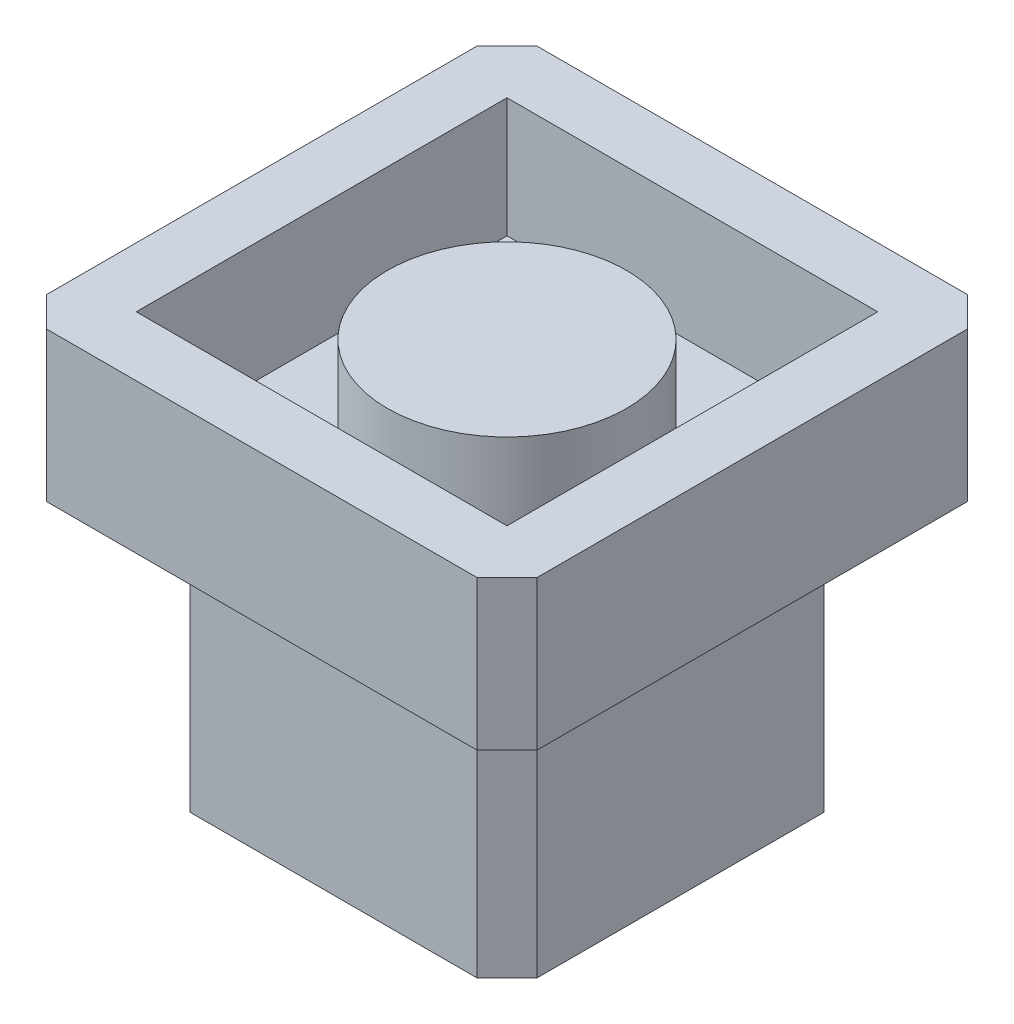
ISO-10303-21;
HEADER;
FILE_DESCRIPTION(('STEP AP214'),'2;1');
FILE_NAME('part.step','',(''),(''),'','','');
FILE_SCHEMA(('AUTOMOTIVE_DESIGN { 1 0 10303 214 1 1 1 1 }'));
ENDSEC;
DATA;
#1=APPLICATION_CONTEXT('core data for automotive mechanical design processes');
#2=APPLICATION_PROTOCOL_DEFINITION('international standard','automotive_design',2000,#1);
#3=PRODUCT_CONTEXT('',#1,'mechanical');
#4=PRODUCT('Part','Part','',(#3));
#5=PRODUCT_RELATED_PRODUCT_CATEGORY('part','',(#4));
#6=PRODUCT_DEFINITION_FORMATION('','',#4);
#7=PRODUCT_DEFINITION_CONTEXT('part definition',#1,'design');
#8=PRODUCT_DEFINITION('design','',#6,#7);
#9=PRODUCT_DEFINITION_SHAPE('','',#8);
#10=(LENGTH_UNIT() NAMED_UNIT(*) SI_UNIT(.MILLI.,.METRE.));
#11=(NAMED_UNIT(*) PLANE_ANGLE_UNIT() SI_UNIT($,.RADIAN.));
#12=(NAMED_UNIT(*) SI_UNIT($,.STERADIAN.) SOLID_ANGLE_UNIT());
#13=UNCERTAINTY_MEASURE_WITH_UNIT(LENGTH_MEASURE(1.E-05),#10,'distance_accuracy_value','');
#14=(GEOMETRIC_REPRESENTATION_CONTEXT(3) GLOBAL_UNCERTAINTY_ASSIGNED_CONTEXT((#13)) GLOBAL_UNIT_ASSIGNED_CONTEXT((#10,
#11,#12)) REPRESENTATION_CONTEXT('',''));
#15=CARTESIAN_POINT('',(0.,0.,0.));
#16=DIRECTION('',(0.,0.,1.));
#17=DIRECTION('',(1.,0.,0.));
#18=AXIS2_PLACEMENT_3D('',#15,#16,#17);
#19=CARTESIAN_POINT('',(0.,-5.,0.));
#20=DIRECTION('',(0.,-1.,0.));
#21=DIRECTION('',(0.,0.,-1.));
#22=AXIS2_PLACEMENT_3D('',#19,#20,#21);
#23=PLANE('',#22);
#24=DIRECTION('',(-1.,0.,0.));
#25=VECTOR('',#24,1.);
#26=CARTESIAN_POINT('',(-2.9,-5.,2.9));
#27=LINE('',#26,#25);
#28=CARTESIAN_POINT('',(2.4,-5.,2.9));
#29=VERTEX_POINT('',#28);
#30=CARTESIAN_POINT('',(-2.4,-5.,2.9));
#31=VERTEX_POINT('',#30);
#32=EDGE_CURVE('E378',#29,#31,#27,.T.);
#33=ORIENTED_EDGE('',*,*,#32,.T.);
#34=DIRECTION('',(0.707106781186549,0.,0.707106781186546));
#35=VECTOR('',#34,1.);
#36=CARTESIAN_POINT('',(-2.65,-5.,2.65));
#37=LINE('',#36,#35);
#38=CARTESIAN_POINT('',(-2.9,-5.,2.4));
#39=VERTEX_POINT('',#38);
#40=EDGE_CURVE('E565',#31,#39,#37,.F.);
#41=ORIENTED_EDGE('',*,*,#40,.T.);
#42=DIRECTION('',(0.,0.,-1.));
#43=VECTOR('',#42,1.);
#44=CARTESIAN_POINT('',(-2.9,-5.,2.9));
#45=LINE('',#44,#43);
#46=CARTESIAN_POINT('',(-2.9,-5.,-2.4));
#47=VERTEX_POINT('',#46);
#48=EDGE_CURVE('E383',#39,#47,#45,.T.);
#49=ORIENTED_EDGE('',*,*,#48,.T.);
#50=DIRECTION('',(-0.707106781186546,0.,0.707106781186549));
#51=VECTOR('',#50,1.);
#52=CARTESIAN_POINT('',(-2.65,-5.,-2.65));
#53=LINE('',#52,#51);
#54=CARTESIAN_POINT('',(-2.4,-5.,-2.9));
#55=VERTEX_POINT('',#54);
#56=EDGE_CURVE('E559',#47,#55,#53,.F.);
#57=ORIENTED_EDGE('',*,*,#56,.T.);
#58=DIRECTION('',(1.,0.,0.));
#59=VECTOR('',#58,1.);
#60=CARTESIAN_POINT('',(-2.9,-5.,-2.9));
#61=LINE('',#60,#59);
#62=CARTESIAN_POINT('',(2.4,-5.,-2.9));
#63=VERTEX_POINT('',#62);
#64=EDGE_CURVE('E387',#55,#63,#61,.T.);
#65=ORIENTED_EDGE('',*,*,#64,.T.);
#66=DIRECTION('',(-0.707106781186549,0.,-0.707106781186546));
#67=VECTOR('',#66,1.);
#68=CARTESIAN_POINT('',(2.65,-5.,-2.65));
#69=LINE('',#68,#67);
#70=CARTESIAN_POINT('',(2.9,-5.,-2.4));
#71=VERTEX_POINT('',#70);
#72=EDGE_CURVE('E556',#63,#71,#69,.F.);
#73=ORIENTED_EDGE('',*,*,#72,.T.);
#74=DIRECTION('',(0.,0.,1.));
#75=VECTOR('',#74,1.);
#76=CARTESIAN_POINT('',(2.9,-5.,2.9));
#77=LINE('',#76,#75);
#78=CARTESIAN_POINT('',(2.9,-5.,2.4));
#79=VERTEX_POINT('',#78);
#80=EDGE_CURVE('E374',#71,#79,#77,.T.);
#81=ORIENTED_EDGE('',*,*,#80,.T.);
#82=DIRECTION('',(0.707106781186546,0.,-0.707106781186549));
#83=VECTOR('',#82,1.);
#84=CARTESIAN_POINT('',(2.65,-5.,2.64999999999999));
#85=LINE('',#84,#83);
#86=EDGE_CURVE('E562',#79,#29,#85,.F.);
#87=ORIENTED_EDGE('',*,*,#86,.T.);
#88=EDGE_LOOP('',(#33,#41,#49,#57,#65,#73,#81,#87));
#89=FACE_BOUND('',#88,.T.);
#90=DIRECTION('',(0.428584206872173,0.,0.903501841514311));
#91=VECTOR('',#90,1.);
#92=CARTESIAN_POINT('',(-1.52620966003311,-5.,-1.33794828279383));
#93=LINE('',#92,#91);
#94=CARTESIAN_POINT('',(-1.52620966003311,-5.,-1.33794828279383));
#95=VERTEX_POINT('',#94);
#96=CARTESIAN_POINT('',(0.134046750223297,-5.,2.16205171720617));
#97=VERTEX_POINT('',#96);
#98=EDGE_CURVE('E299',#95,#97,#93,.T.);
#99=ORIENTED_EDGE('',*,*,#98,.T.);
#100=DIRECTION('',(1.,0.,0.));
#101=VECTOR('',#100,1.);
#102=CARTESIAN_POINT('',(0.134046750223297,-5.,2.16205171720617));
#103=LINE('',#102,#101);
#104=CARTESIAN_POINT('',(0.178918545095092,-5.,2.16205171720617));
#105=VERTEX_POINT('',#104);
#106=EDGE_CURVE('E64',#97,#105,#103,.T.);
#107=ORIENTED_EDGE('',*,*,#106,.T.);
#108=DIRECTION('',(0.419058177461747,0.,-0.907959384500452));
#109=VECTOR('',#108,1.);
#110=CARTESIAN_POINT('',(0.178918545095092,-5.,2.16205171720617));
#111=LINE('',#110,#109);
#112=CARTESIAN_POINT('',(1.79430316047971,-5.,-1.33794828279383));
#113=VERTEX_POINT('',#112);
#114=EDGE_CURVE('E323',#105,#113,#111,.T.);
#115=ORIENTED_EDGE('',*,*,#114,.T.);
#116=DIRECTION('',(-1.,0.,0.));
#117=VECTOR('',#116,1.);
#118=CARTESIAN_POINT('',(1.79430316047971,-5.,-1.33794828279383));
#119=LINE('',#118,#117);
#120=CARTESIAN_POINT('',(1.45285684637714,-5.,-1.33794828279383));
#121=VERTEX_POINT('',#120);
#122=EDGE_CURVE('E327',#113,#121,#119,.T.);
#123=ORIENTED_EDGE('',*,*,#122,.T.);
#124=DIRECTION('',(-0.418842224744609,0.,0.908059023836549));
#125=VECTOR('',#124,1.);
#126=CARTESIAN_POINT('',(1.45285684637714,-5.,-1.33794828279383));
#127=LINE('',#126,#125);
#128=CARTESIAN_POINT('',(0.935428961761758,-5.,-0.216153410998961));
#129=VERTEX_POINT('',#128);
#130=EDGE_CURVE('E331',#121,#129,#127,.T.);
#131=ORIENTED_EDGE('',*,*,#130,.T.);
#132=DIRECTION('',(-1.,0.,0.));
#133=VECTOR('',#132,1.);
#134=CARTESIAN_POINT('',(0.935428961761758,-5.,-0.216153410998961));
#135=LINE('',#134,#133);
#136=CARTESIAN_POINT('',(-0.651209660033114,-5.,-0.216153410998961));
#137=VERTEX_POINT('',#136);
#138=EDGE_CURVE('E335',#129,#137,#135,.T.);
#139=ORIENTED_EDGE('',*,*,#138,.T.);
#140=DIRECTION('',(-0.428596026355544,0.,-0.903496234741594));
#141=VECTOR('',#140,1.);
#142=CARTESIAN_POINT('',(-0.651209660033114,-5.,-0.216153410998961));
#143=LINE('',#142,#141);
#144=CARTESIAN_POINT('',(-1.18336110234081,-5.,-1.33794828279383));
#145=VERTEX_POINT('',#144);
#146=EDGE_CURVE('E339',#137,#145,#143,.T.);
#147=ORIENTED_EDGE('',*,*,#146,.T.);
#148=DIRECTION('',(-1.,0.,0.));
#149=VECTOR('',#148,1.);
#150=CARTESIAN_POINT('',(-1.18336110234081,-5.,-1.33794828279383));
#151=LINE('',#150,#149);
#152=EDGE_CURVE('E343',#145,#95,#151,.T.);
#153=ORIENTED_EDGE('',*,*,#152,.T.);
#154=EDGE_LOOP('',(#99,#107,#115,#123,#131,#139,#147,#153));
#155=FACE_BOUND('',#154,.T.);
#156=ADVANCED_FACE('F47',(#89,#155),#23,.T.);
#157=CARTESIAN_POINT('',(0.,-0.5,0.));
#158=DIRECTION('',(0.,1.,0.));
#159=DIRECTION('',(0.,0.,1.));
#160=AXIS2_PLACEMENT_3D('',#157,#158,#159);
#161=PLANE('',#160);
#162=DIRECTION('',(0.,0.,1.));
#163=VECTOR('',#162,1.);
#164=CARTESIAN_POINT('',(-4.1,-0.5,0.));
#165=LINE('',#164,#163);
#166=CARTESIAN_POINT('',(-4.1,-0.5,-3.6));
#167=VERTEX_POINT('',#166);
#168=CARTESIAN_POINT('',(-4.1,-0.5,3.6));
#169=VERTEX_POINT('',#168);
#170=EDGE_CURVE('E470',#167,#169,#165,.T.);
#171=ORIENTED_EDGE('',*,*,#170,.F.);
#172=DIRECTION('',(0.707106781186546,0.,-0.707106781186549));
#173=VECTOR('',#172,1.);
#174=CARTESIAN_POINT('',(-3.6,-0.5,-4.1));
#175=LINE('',#174,#173);
#176=CARTESIAN_POINT('',(-3.6,-0.5,-4.1));
#177=VERTEX_POINT('',#176);
#178=EDGE_CURVE('E525',#167,#177,#175,.T.);
#179=ORIENTED_EDGE('',*,*,#178,.T.);
#180=DIRECTION('',(1.,0.,0.));
#181=VECTOR('',#180,1.);
#182=CARTESIAN_POINT('',(0.,-0.5,-4.1));
#183=LINE('',#182,#181);
#184=CARTESIAN_POINT('',(3.6,-0.5,-4.1));
#185=VERTEX_POINT('',#184);
#186=EDGE_CURVE('E466',#177,#185,#183,.T.);
#187=ORIENTED_EDGE('',*,*,#186,.T.);
#188=DIRECTION('',(-0.707106781186549,0.,-0.707106781186546));
#189=VECTOR('',#188,1.);
#190=CARTESIAN_POINT('',(4.1,-0.5,-3.6));
#191=LINE('',#190,#189);
#192=CARTESIAN_POINT('',(4.1,-0.5,-3.6));
#193=VERTEX_POINT('',#192);
#194=EDGE_CURVE('E522',#185,#193,#191,.F.);
#195=ORIENTED_EDGE('',*,*,#194,.T.);
#196=DIRECTION('',(0.,0.,1.));
#197=VECTOR('',#196,1.);
#198=CARTESIAN_POINT('',(4.1,-0.5,0.));
#199=LINE('',#198,#197);
#200=CARTESIAN_POINT('',(4.1,-0.5,3.6));
#201=VERTEX_POINT('',#200);
#202=EDGE_CURVE('E478',#193,#201,#199,.T.);
#203=ORIENTED_EDGE('',*,*,#202,.T.);
#204=DIRECTION('',(-0.707106781186546,0.,0.707106781186549));
#205=VECTOR('',#204,1.);
#206=CARTESIAN_POINT('',(3.6,-0.5,4.1));
#207=LINE('',#206,#205);
#208=CARTESIAN_POINT('',(3.6,-0.5,4.1));
#209=VERTEX_POINT('',#208);
#210=EDGE_CURVE('E516',#201,#209,#207,.T.);
#211=ORIENTED_EDGE('',*,*,#210,.T.);
#212=DIRECTION('',(1.,0.,0.));
#213=VECTOR('',#212,1.);
#214=CARTESIAN_POINT('',(0.,-0.5,4.1));
#215=LINE('',#214,#213);
#216=CARTESIAN_POINT('',(-3.6,-0.5,4.1));
#217=VERTEX_POINT('',#216);
#218=EDGE_CURVE('E474',#217,#209,#215,.T.);
#219=ORIENTED_EDGE('',*,*,#218,.F.);
#220=DIRECTION('',(0.707106781186549,0.,0.707106781186546));
#221=VECTOR('',#220,1.);
#222=CARTESIAN_POINT('',(-4.1,-0.5,3.6));
#223=LINE('',#222,#221);
#224=EDGE_CURVE('E519',#217,#169,#223,.F.);
#225=ORIENTED_EDGE('',*,*,#224,.T.);
#226=EDGE_LOOP('',(#171,#179,#187,#195,#203,#211,#219,#225));
#227=FACE_BOUND('',#226,.T.);
#228=DIRECTION('',(0.,0.,1.));
#229=VECTOR('',#228,1.);
#230=CARTESIAN_POINT('',(2.9,-0.5,2.9));
#231=LINE('',#230,#229);
#232=CARTESIAN_POINT('',(2.9,-0.5,-2.4));
#233=VERTEX_POINT('',#232);
#234=CARTESIAN_POINT('',(2.9,-0.5,2.4));
#235=VERTEX_POINT('',#234);
#236=EDGE_CURVE('E373',#233,#235,#231,.T.);
#237=ORIENTED_EDGE('',*,*,#236,.F.);
#238=DIRECTION('',(0.707106781186549,0.,0.707106781186546));
#239=VECTOR('',#238,1.);
#240=CARTESIAN_POINT('',(2.65,-0.5,-2.65));
#241=LINE('',#240,#239);
#242=CARTESIAN_POINT('',(2.4,-0.5,-2.9));
#243=VERTEX_POINT('',#242);
#244=EDGE_CURVE('E11',#233,#243,#241,.F.);
#245=ORIENTED_EDGE('',*,*,#244,.T.);
#246=DIRECTION('',(1.,0.,0.));
#247=VECTOR('',#246,1.);
#248=CARTESIAN_POINT('',(-2.9,-0.5,-2.9));
#249=LINE('',#248,#247);
#250=CARTESIAN_POINT('',(-2.4,-0.5,-2.9));
#251=VERTEX_POINT('',#250);
#252=EDGE_CURVE('E379',#251,#243,#249,.T.);
#253=ORIENTED_EDGE('',*,*,#252,.F.);
#254=DIRECTION('',(0.707106781186546,0.,-0.707106781186549));
#255=VECTOR('',#254,1.);
#256=CARTESIAN_POINT('',(-2.65,-0.5,-2.65));
#257=LINE('',#256,#255);
#258=CARTESIAN_POINT('',(-2.9,-0.5,-2.4));
#259=VERTEX_POINT('',#258);
#260=EDGE_CURVE('E57',#251,#259,#257,.F.);
#261=ORIENTED_EDGE('',*,*,#260,.T.);
#262=DIRECTION('',(0.,0.,-1.));
#263=VECTOR('',#262,1.);
#264=CARTESIAN_POINT('',(-2.9,-0.5,2.9));
#265=LINE('',#264,#263);
#266=CARTESIAN_POINT('',(-2.9,-0.5,2.4));
#267=VERTEX_POINT('',#266);
#268=EDGE_CURVE('E399',#267,#259,#265,.T.);
#269=ORIENTED_EDGE('',*,*,#268,.F.);
#270=DIRECTION('',(-0.707106781186549,0.,-0.707106781186546));
#271=VECTOR('',#270,1.);
#272=CARTESIAN_POINT('',(-2.65,-0.5,2.65));
#273=LINE('',#272,#271);
#274=CARTESIAN_POINT('',(-2.4,-0.5,2.9));
#275=VERTEX_POINT('',#274);
#276=EDGE_CURVE('E582',#267,#275,#273,.F.);
#277=ORIENTED_EDGE('',*,*,#276,.T.);
#278=DIRECTION('',(-1.,0.,0.));
#279=VECTOR('',#278,1.);
#280=CARTESIAN_POINT('',(-2.9,-0.5,2.9));
#281=LINE('',#280,#279);
#282=CARTESIAN_POINT('',(2.4,-0.5,2.9));
#283=VERTEX_POINT('',#282);
#284=EDGE_CURVE('E395',#283,#275,#281,.T.);
#285=ORIENTED_EDGE('',*,*,#284,.F.);
#286=DIRECTION('',(-0.707106781186546,0.,0.707106781186549));
#287=VECTOR('',#286,1.);
#288=CARTESIAN_POINT('',(2.65,-0.5,2.64999999999999));
#289=LINE('',#288,#287);
#290=EDGE_CURVE('E585',#283,#235,#289,.F.);
#291=ORIENTED_EDGE('',*,*,#290,.T.);
#292=EDGE_LOOP('',(#237,#245,#253,#261,#269,#277,#285,#291));
#293=FACE_BOUND('',#292,.T.);
#294=ADVANCED_FACE('F592',(#227,#293),#161,.F.);
#295=CARTESIAN_POINT('',(0.,0.,0.));
#296=DIRECTION('',(0.,1.,0.));
#297=DIRECTION('',(0.,0.,1.));
#298=AXIS2_PLACEMENT_3D('',#295,#296,#297);
#299=PLANE('',#298);
#300=CARTESIAN_POINT('',(0.,0.,0.));
#301=DIRECTION('',(0.,1.,0.));
#302=DIRECTION('',(0.,0.,1.));
#303=AXIS2_PLACEMENT_3D('',#300,#301,#302);
#304=CIRCLE('',#303,2.);
#305=CARTESIAN_POINT('',(0.,0.,2.));
#306=VERTEX_POINT('',#305);
#307=EDGE_CURVE('E482',#306,#306,#304,.T.);
#308=ORIENTED_EDGE('',*,*,#307,.F.);
#309=EDGE_LOOP('',(#308));
#310=FACE_BOUND('',#309,.T.);
#311=DIRECTION('',(0.,0.,1.));
#312=VECTOR('',#311,1.);
#313=CARTESIAN_POINT('',(3.1,0.,0.));
#314=LINE('',#313,#312);
#315=CARTESIAN_POINT('',(3.1,0.,-3.1));
#316=VERTEX_POINT('',#315);
#317=CARTESIAN_POINT('',(3.1,0.,3.1));
#318=VERTEX_POINT('',#317);
#319=EDGE_CURVE('E442',#316,#318,#314,.T.);
#320=ORIENTED_EDGE('',*,*,#319,.F.);
#321=DIRECTION('',(1.,0.,0.));
#322=VECTOR('',#321,1.);
#323=CARTESIAN_POINT('',(0.,0.,-3.1));
#324=LINE('',#323,#322);
#325=CARTESIAN_POINT('',(-3.1,0.,-3.1));
#326=VERTEX_POINT('',#325);
#327=EDGE_CURVE('E391',#326,#316,#324,.T.);
#328=ORIENTED_EDGE('',*,*,#327,.F.);
#329=DIRECTION('',(0.,0.,1.));
#330=VECTOR('',#329,1.);
#331=CARTESIAN_POINT('',(-3.1,0.,0.));
#332=LINE('',#331,#330);
#333=CARTESIAN_POINT('',(-3.1,0.,3.1));
#334=VERTEX_POINT('',#333);
#335=EDGE_CURVE('E411',#326,#334,#332,.T.);
#336=ORIENTED_EDGE('',*,*,#335,.T.);
#337=DIRECTION('',(1.,0.,0.));
#338=VECTOR('',#337,1.);
#339=CARTESIAN_POINT('',(0.,0.,3.1));
#340=LINE('',#339,#338);
#341=EDGE_CURVE('E446',#334,#318,#340,.T.);
#342=ORIENTED_EDGE('',*,*,#341,.T.);
#343=EDGE_LOOP('',(#320,#328,#336,#342));
#344=FACE_BOUND('',#343,.T.);
#345=ADVANCED_FACE('F645',(#310,#344),#299,.T.);
#346=CARTESIAN_POINT('',(0.,1.6,0.));
#347=DIRECTION('',(0.,-1.,0.));
#348=DIRECTION('',(0.,0.,-1.));
#349=AXIS2_PLACEMENT_3D('',#346,#347,#348);
#350=CYLINDRICAL_SURFACE('',#349,2.);
#351=CARTESIAN_POINT('',(0.,1.6,0.));
#352=DIRECTION('',(0.,1.,0.));
#353=DIRECTION('',(0.,0.,1.));
#354=AXIS2_PLACEMENT_3D('',#351,#352,#353);
#355=CIRCLE('',#354,2.);
#356=CARTESIAN_POINT('',(0.,1.6,2.));
#357=VERTEX_POINT('',#356);
#358=EDGE_CURVE('E483',#357,#357,#355,.T.);
#359=ORIENTED_EDGE('',*,*,#358,.F.);
#360=EDGE_LOOP('',(#359));
#361=FACE_BOUND('',#360,.T.);
#362=ORIENTED_EDGE('',*,*,#307,.T.);
#363=EDGE_LOOP('',(#362));
#364=FACE_BOUND('',#363,.T.);
#365=ADVANCED_FACE('F731',(#361,#364),#350,.T.);
#366=CARTESIAN_POINT('',(0.,1.6,0.));
#367=DIRECTION('',(0.,1.,0.));
#368=DIRECTION('',(0.,0.,1.));
#369=AXIS2_PLACEMENT_3D('',#366,#367,#368);
#370=PLANE('',#369);
#371=ORIENTED_EDGE('',*,*,#358,.T.);
#372=EDGE_LOOP('',(#371));
#373=FACE_BOUND('',#372,.T.);
#374=ADVANCED_FACE('F734',(#373),#370,.T.);
#375=CARTESIAN_POINT('',(0.,2.,-3.1));
#376=DIRECTION('',(0.,0.,-1.));
#377=DIRECTION('',(-1.,0.,0.));
#378=AXIS2_PLACEMENT_3D('',#375,#376,#377);
#379=PLANE('',#378);
#380=ORIENTED_EDGE('',*,*,#327,.T.);
#381=DIRECTION('',(0.,-1.,0.));
#382=VECTOR('',#381,1.);
#383=CARTESIAN_POINT('',(3.1,2.,-3.1));
#384=LINE('',#383,#382);
#385=CARTESIAN_POINT('',(3.1,2.,-3.1));
#386=VERTEX_POINT('',#385);
#387=EDGE_CURVE('E462',#386,#316,#384,.T.);
#388=ORIENTED_EDGE('',*,*,#387,.F.);
#389=DIRECTION('',(1.,0.,0.));
#390=VECTOR('',#389,1.);
#391=CARTESIAN_POINT('',(0.,2.,-3.1));
#392=LINE('',#391,#390);
#393=CARTESIAN_POINT('',(-3.1,2.,-3.1));
#394=VERTEX_POINT('',#393);
#395=EDGE_CURVE('E423',#394,#386,#392,.T.);
#396=ORIENTED_EDGE('',*,*,#395,.F.);
#397=DIRECTION('',(0.,-1.,0.));
#398=VECTOR('',#397,1.);
#399=CARTESIAN_POINT('',(-3.1,2.,-3.1));
#400=LINE('',#399,#398);
#401=EDGE_CURVE('E438',#394,#326,#400,.T.);
#402=ORIENTED_EDGE('',*,*,#401,.T.);
#403=EDGE_LOOP('',(#380,#388,#396,#402));
#404=FACE_BOUND('',#403,.T.);
#405=ADVANCED_FACE('F738',(#404),#379,.F.);
#406=CARTESIAN_POINT('',(3.1,2.,0.));
#407=DIRECTION('',(1.,0.,0.));
#408=DIRECTION('',(0.,0.,-1.));
#409=AXIS2_PLACEMENT_3D('',#406,#407,#408);
#410=PLANE('',#409);
#411=ORIENTED_EDGE('',*,*,#319,.T.);
#412=DIRECTION('',(0.,-1.,0.));
#413=VECTOR('',#412,1.);
#414=CARTESIAN_POINT('',(3.1,2.,3.1));
#415=LINE('',#414,#413);
#416=CARTESIAN_POINT('',(3.1,2.,3.1));
#417=VERTEX_POINT('',#416);
#418=EDGE_CURVE('E458',#417,#318,#415,.T.);
#419=ORIENTED_EDGE('',*,*,#418,.F.);
#420=DIRECTION('',(0.,0.,1.));
#421=VECTOR('',#420,1.);
#422=CARTESIAN_POINT('',(3.1,2.,0.));
#423=LINE('',#422,#421);
#424=EDGE_CURVE('E427',#386,#417,#423,.T.);
#425=ORIENTED_EDGE('',*,*,#424,.F.);
#426=ORIENTED_EDGE('',*,*,#387,.T.);
#427=EDGE_LOOP('',(#411,#419,#425,#426));
#428=FACE_BOUND('',#427,.T.);
#429=ADVANCED_FACE('F762',(#428),#410,.F.);
#430=CARTESIAN_POINT('',(0.,2.,3.1));
#431=DIRECTION('',(0.,0.,-1.));
#432=DIRECTION('',(-1.,0.,0.));
#433=AXIS2_PLACEMENT_3D('',#430,#431,#432);
#434=PLANE('',#433);
#435=ORIENTED_EDGE('',*,*,#341,.F.);
#436=DIRECTION('',(0.,-1.,0.));
#437=VECTOR('',#436,1.);
#438=CARTESIAN_POINT('',(-3.1,2.,3.1));
#439=LINE('',#438,#437);
#440=CARTESIAN_POINT('',(-3.1,2.,3.1));
#441=VERTEX_POINT('',#440);
#442=EDGE_CURVE('E454',#441,#334,#439,.T.);
#443=ORIENTED_EDGE('',*,*,#442,.F.);
#444=DIRECTION('',(1.,0.,0.));
#445=VECTOR('',#444,1.);
#446=CARTESIAN_POINT('',(0.,2.,3.1));
#447=LINE('',#446,#445);
#448=EDGE_CURVE('E430',#441,#417,#447,.T.);
#449=ORIENTED_EDGE('',*,*,#448,.T.);
#450=ORIENTED_EDGE('',*,*,#418,.T.);
#451=EDGE_LOOP('',(#435,#443,#449,#450));
#452=FACE_BOUND('',#451,.T.);
#453=ADVANCED_FACE('F766',(#452),#434,.T.);
#454=CARTESIAN_POINT('',(-3.1,2.,0.));
#455=DIRECTION('',(1.,0.,0.));
#456=DIRECTION('',(0.,0.,-1.));
#457=AXIS2_PLACEMENT_3D('',#454,#455,#456);
#458=PLANE('',#457);
#459=ORIENTED_EDGE('',*,*,#335,.F.);
#460=ORIENTED_EDGE('',*,*,#401,.F.);
#461=DIRECTION('',(0.,0.,1.));
#462=VECTOR('',#461,1.);
#463=CARTESIAN_POINT('',(-3.1,2.,0.));
#464=LINE('',#463,#462);
#465=EDGE_CURVE('E434',#394,#441,#464,.T.);
#466=ORIENTED_EDGE('',*,*,#465,.T.);
#467=ORIENTED_EDGE('',*,*,#442,.T.);
#468=EDGE_LOOP('',(#459,#460,#466,#467));
#469=FACE_BOUND('',#468,.T.);
#470=ADVANCED_FACE('F770',(#469),#458,.T.);
#471=CARTESIAN_POINT('',(0.,2.,0.));
#472=DIRECTION('',(0.,1.,0.));
#473=DIRECTION('',(0.,0.,1.));
#474=AXIS2_PLACEMENT_3D('',#471,#472,#473);
#475=PLANE('',#474);
#476=DIRECTION('',(1.,0.,0.));
#477=VECTOR('',#476,1.);
#478=CARTESIAN_POINT('',(0.,2.,-4.1));
#479=LINE('',#478,#477);
#480=CARTESIAN_POINT('',(-3.6,2.,-4.1));
#481=VERTEX_POINT('',#480);
#482=CARTESIAN_POINT('',(3.6,2.,-4.1));
#483=VERTEX_POINT('',#482);
#484=EDGE_CURVE('E406',#481,#483,#479,.T.);
#485=ORIENTED_EDGE('',*,*,#484,.F.);
#486=DIRECTION('',(-0.707106781186546,0.,0.707106781186549));
#487=VECTOR('',#486,1.);
#488=CARTESIAN_POINT('',(-3.85000000000001,2.,-3.84999999999999));
#489=LINE('',#488,#487);
#490=CARTESIAN_POINT('',(-4.1,2.,-3.6));
#491=VERTEX_POINT('',#490);
#492=EDGE_CURVE('E506',#481,#491,#489,.T.);
#493=ORIENTED_EDGE('',*,*,#492,.T.);
#494=DIRECTION('',(0.,0.,1.));
#495=VECTOR('',#494,1.);
#496=CARTESIAN_POINT('',(-4.1,2.,0.));
#497=LINE('',#496,#495);
#498=CARTESIAN_POINT('',(-4.1,2.,3.6));
#499=VERTEX_POINT('',#498);
#500=EDGE_CURVE('E410',#491,#499,#497,.T.);
#501=ORIENTED_EDGE('',*,*,#500,.T.);
#502=DIRECTION('',(-0.707106781186549,0.,-0.707106781186546));
#503=VECTOR('',#502,1.);
#504=CARTESIAN_POINT('',(-3.84999999999999,2.,3.85000000000001));
#505=LINE('',#504,#503);
#506=CARTESIAN_POINT('',(-3.6,2.,4.1));
#507=VERTEX_POINT('',#506);
#508=EDGE_CURVE('E500',#499,#507,#505,.F.);
#509=ORIENTED_EDGE('',*,*,#508,.T.);
#510=DIRECTION('',(1.,0.,0.));
#511=VECTOR('',#510,1.);
#512=CARTESIAN_POINT('',(0.,2.,4.1));
#513=LINE('',#512,#511);
#514=CARTESIAN_POINT('',(3.6,2.,4.1));
#515=VERTEX_POINT('',#514);
#516=EDGE_CURVE('E415',#507,#515,#513,.T.);
#517=ORIENTED_EDGE('',*,*,#516,.T.);
#518=DIRECTION('',(0.707106781186546,0.,-0.707106781186549));
#519=VECTOR('',#518,1.);
#520=CARTESIAN_POINT('',(3.85000000000001,2.,3.84999999999999));
#521=LINE('',#520,#519);
#522=CARTESIAN_POINT('',(4.1,2.,3.6));
#523=VERTEX_POINT('',#522);
#524=EDGE_CURVE('E497',#515,#523,#521,.T.);
#525=ORIENTED_EDGE('',*,*,#524,.T.);
#526=DIRECTION('',(0.,0.,1.));
#527=VECTOR('',#526,1.);
#528=CARTESIAN_POINT('',(4.1,2.,0.));
#529=LINE('',#528,#527);
#530=CARTESIAN_POINT('',(4.1,2.,-3.6));
#531=VERTEX_POINT('',#530);
#532=EDGE_CURVE('E419',#531,#523,#529,.T.);
#533=ORIENTED_EDGE('',*,*,#532,.F.);
#534=DIRECTION('',(0.707106781186549,0.,0.707106781186546));
#535=VECTOR('',#534,1.);
#536=CARTESIAN_POINT('',(3.84999999999999,2.,-3.85000000000001));
#537=LINE('',#536,#535);
#538=EDGE_CURVE('E503',#531,#483,#537,.F.);
#539=ORIENTED_EDGE('',*,*,#538,.T.);
#540=EDGE_LOOP('',(#485,#493,#501,#509,#517,#525,#533,#539));
#541=FACE_BOUND('',#540,.T.);
#542=ORIENTED_EDGE('',*,*,#395,.T.);
#543=ORIENTED_EDGE('',*,*,#424,.T.);
#544=ORIENTED_EDGE('',*,*,#448,.F.);
#545=ORIENTED_EDGE('',*,*,#465,.F.);
#546=EDGE_LOOP('',(#542,#543,#544,#545));
#547=FACE_BOUND('',#546,.T.);
#548=ADVANCED_FACE('F755',(#541,#547),#475,.T.);
#549=CARTESIAN_POINT('',(4.1,-0.5,0.));
#550=DIRECTION('',(-1.,0.,0.));
#551=DIRECTION('',(0.,0.,1.));
#552=AXIS2_PLACEMENT_3D('',#549,#550,#551);
#553=PLANE('',#552);
#554=ORIENTED_EDGE('',*,*,#202,.F.);
#555=DIRECTION('',(0.,1.,0.));
#556=VECTOR('',#555,1.);
#557=CARTESIAN_POINT('',(4.1,-0.5,-3.6));
#558=LINE('',#557,#556);
#559=EDGE_CURVE('E531',#193,#531,#558,.T.);
#560=ORIENTED_EDGE('',*,*,#559,.T.);
#561=ORIENTED_EDGE('',*,*,#532,.T.);
#562=DIRECTION('',(0.,-1.,0.));
#563=VECTOR('',#562,1.);
#564=CARTESIAN_POINT('',(4.1,-0.5,3.6));
#565=LINE('',#564,#563);
#566=EDGE_CURVE('E528',#523,#201,#565,.T.);
#567=ORIENTED_EDGE('',*,*,#566,.T.);
#568=EDGE_LOOP('',(#554,#560,#561,#567));
#569=FACE_BOUND('',#568,.T.);
#570=ADVANCED_FACE('F751',(#569),#553,.F.);
#571=CARTESIAN_POINT('',(0.,-0.5,4.1));
#572=DIRECTION('',(0.,0.,1.));
#573=DIRECTION('',(1.,0.,0.));
#574=AXIS2_PLACEMENT_3D('',#571,#572,#573);
#575=PLANE('',#574);
#576=ORIENTED_EDGE('',*,*,#516,.F.);
#577=DIRECTION('',(0.,-1.,0.));
#578=VECTOR('',#577,1.);
#579=CARTESIAN_POINT('',(-3.6,-0.5,4.1));
#580=LINE('',#579,#578);
#581=EDGE_CURVE('E539',#507,#217,#580,.T.);
#582=ORIENTED_EDGE('',*,*,#581,.T.);
#583=ORIENTED_EDGE('',*,*,#218,.T.);
#584=DIRECTION('',(0.,1.,0.));
#585=VECTOR('',#584,1.);
#586=CARTESIAN_POINT('',(3.6,2.,4.1));
#587=LINE('',#586,#585);
#588=EDGE_CURVE('E535',#209,#515,#587,.T.);
#589=ORIENTED_EDGE('',*,*,#588,.T.);
#590=EDGE_LOOP('',(#576,#582,#583,#589));
#591=FACE_BOUND('',#590,.T.);
#592=ADVANCED_FACE('F747',(#591),#575,.T.);
#593=CARTESIAN_POINT('',(-4.1,-0.5,0.));
#594=DIRECTION('',(-1.,0.,0.));
#595=DIRECTION('',(0.,0.,1.));
#596=AXIS2_PLACEMENT_3D('',#593,#594,#595);
#597=PLANE('',#596);
#598=ORIENTED_EDGE('',*,*,#500,.F.);
#599=DIRECTION('',(0.,-1.,0.));
#600=VECTOR('',#599,1.);
#601=CARTESIAN_POINT('',(-4.1,-0.5,-3.6));
#602=LINE('',#601,#600);
#603=EDGE_CURVE('E513',#491,#167,#602,.T.);
#604=ORIENTED_EDGE('',*,*,#603,.T.);
#605=ORIENTED_EDGE('',*,*,#170,.T.);
#606=DIRECTION('',(0.,1.,0.));
#607=VECTOR('',#606,1.);
#608=CARTESIAN_POINT('',(-4.1,-0.5,3.6));
#609=LINE('',#608,#607);
#610=EDGE_CURVE('E509',#169,#499,#609,.T.);
#611=ORIENTED_EDGE('',*,*,#610,.T.);
#612=EDGE_LOOP('',(#598,#604,#605,#611));
#613=FACE_BOUND('',#612,.T.);
#614=ADVANCED_FACE('F743',(#613),#597,.T.);
#615=CARTESIAN_POINT('',(0.,-0.5,-4.1));
#616=DIRECTION('',(0.,0.,1.));
#617=DIRECTION('',(1.,0.,0.));
#618=AXIS2_PLACEMENT_3D('',#615,#616,#617);
#619=PLANE('',#618);
#620=ORIENTED_EDGE('',*,*,#186,.F.);
#621=DIRECTION('',(0.,1.,0.));
#622=VECTOR('',#621,1.);
#623=CARTESIAN_POINT('',(-3.6,2.,-4.1));
#624=LINE('',#623,#622);
#625=EDGE_CURVE('E493',#177,#481,#624,.T.);
#626=ORIENTED_EDGE('',*,*,#625,.T.);
#627=ORIENTED_EDGE('',*,*,#484,.T.);
#628=DIRECTION('',(0.,-1.,0.));
#629=VECTOR('',#628,1.);
#630=CARTESIAN_POINT('',(3.6,-0.5,-4.1));
#631=LINE('',#630,#629);
#632=EDGE_CURVE('E487',#483,#185,#631,.T.);
#633=ORIENTED_EDGE('',*,*,#632,.T.);
#634=EDGE_LOOP('',(#620,#626,#627,#633));
#635=FACE_BOUND('',#634,.T.);
#636=ADVANCED_FACE('F740',(#635),#619,.F.);
#637=CARTESIAN_POINT('',(2.9,-5.,2.9));
#638=DIRECTION('',(-1.,0.,0.));
#639=DIRECTION('',(0.,0.,1.));
#640=AXIS2_PLACEMENT_3D('',#637,#638,#639);
#641=PLANE('',#640);
#642=ORIENTED_EDGE('',*,*,#236,.T.);
#643=DIRECTION('',(0.,-1.,0.));
#644=VECTOR('',#643,1.);
#645=CARTESIAN_POINT('',(2.9,-5.,2.4));
#646=LINE('',#645,#644);
#647=EDGE_CURVE('E572',#235,#79,#646,.T.);
#648=ORIENTED_EDGE('',*,*,#647,.T.);
#649=ORIENTED_EDGE('',*,*,#80,.F.);
#650=DIRECTION('',(0.,1.,0.));
#651=VECTOR('',#650,1.);
#652=CARTESIAN_POINT('',(2.9,-5.,-2.4));
#653=LINE('',#652,#651);
#654=EDGE_CURVE('E568',#71,#233,#653,.T.);
#655=ORIENTED_EDGE('',*,*,#654,.T.);
#656=EDGE_LOOP('',(#642,#648,#649,#655));
#657=FACE_BOUND('',#656,.T.);
#658=ADVANCED_FACE('F614',(#657),#641,.F.);
#659=CARTESIAN_POINT('',(-2.9,-5.,2.9));
#660=DIRECTION('',(0.,0.,-1.));
#661=DIRECTION('',(-1.,0.,0.));
#662=AXIS2_PLACEMENT_3D('',#659,#660,#661);
#663=PLANE('',#662);
#664=ORIENTED_EDGE('',*,*,#284,.T.);
#665=DIRECTION('',(0.,-1.,0.));
#666=VECTOR('',#665,1.);
#667=CARTESIAN_POINT('',(-2.4,-5.,2.9));
#668=LINE('',#667,#666);
#669=EDGE_CURVE('E553',#275,#31,#668,.T.);
#670=ORIENTED_EDGE('',*,*,#669,.T.);
#671=ORIENTED_EDGE('',*,*,#32,.F.);
#672=DIRECTION('',(0.,1.,0.));
#673=VECTOR('',#672,1.);
#674=CARTESIAN_POINT('',(2.4,-5.,2.9));
#675=LINE('',#674,#673);
#676=EDGE_CURVE('E549',#29,#283,#675,.T.);
#677=ORIENTED_EDGE('',*,*,#676,.T.);
#678=EDGE_LOOP('',(#664,#670,#671,#677));
#679=FACE_BOUND('',#678,.T.);
#680=ADVANCED_FACE('F622',(#679),#663,.F.);
#681=CARTESIAN_POINT('',(-2.9,-5.,2.9));
#682=DIRECTION('',(1.,0.,0.));
#683=DIRECTION('',(0.,0.,-1.));
#684=AXIS2_PLACEMENT_3D('',#681,#682,#683);
#685=PLANE('',#684);
#686=ORIENTED_EDGE('',*,*,#48,.F.);
#687=DIRECTION('',(0.,1.,0.));
#688=VECTOR('',#687,1.);
#689=CARTESIAN_POINT('',(-2.9,-5.,2.4));
#690=LINE('',#689,#688);
#691=EDGE_CURVE('E545',#39,#267,#690,.T.);
#692=ORIENTED_EDGE('',*,*,#691,.T.);
#693=ORIENTED_EDGE('',*,*,#268,.T.);
#694=DIRECTION('',(0.,-1.,0.));
#695=VECTOR('',#694,1.);
#696=CARTESIAN_POINT('',(-2.9,-5.,-2.4));
#697=LINE('',#696,#695);
#698=EDGE_CURVE('E542',#259,#47,#697,.T.);
#699=ORIENTED_EDGE('',*,*,#698,.T.);
#700=EDGE_LOOP('',(#686,#692,#693,#699));
#701=FACE_BOUND('',#700,.T.);
#702=ADVANCED_FACE('F598',(#701),#685,.F.);
#703=CARTESIAN_POINT('',(-2.9,-5.,-2.9));
#704=DIRECTION('',(0.,0.,1.));
#705=DIRECTION('',(1.,0.,0.));
#706=AXIS2_PLACEMENT_3D('',#703,#704,#705);
#707=PLANE('',#706);
#708=ORIENTED_EDGE('',*,*,#64,.F.);
#709=DIRECTION('',(0.,1.,0.));
#710=VECTOR('',#709,1.);
#711=CARTESIAN_POINT('',(-2.4,-5.,-2.9));
#712=LINE('',#711,#710);
#713=EDGE_CURVE('E578',#55,#251,#712,.T.);
#714=ORIENTED_EDGE('',*,*,#713,.T.);
#715=ORIENTED_EDGE('',*,*,#252,.T.);
#716=DIRECTION('',(0.,-1.,0.));
#717=VECTOR('',#716,1.);
#718=CARTESIAN_POINT('',(2.4,-5.,-2.9));
#719=LINE('',#718,#717);
#720=EDGE_CURVE('E575',#243,#63,#719,.T.);
#721=ORIENTED_EDGE('',*,*,#720,.T.);
#722=EDGE_LOOP('',(#708,#714,#715,#721));
#723=FACE_BOUND('',#722,.T.);
#724=ADVANCED_FACE('F607',(#723),#707,.F.);
#725=CARTESIAN_POINT('',(-3.6,-0.5,-4.1));
#726=DIRECTION('',(-0.707106781186549,0.,-0.707106781186546));
#727=DIRECTION('',(0.,-1.,0.));
#728=AXIS2_PLACEMENT_3D('',#725,#726,#727);
#729=PLANE('',#728);
#730=ORIENTED_EDGE('',*,*,#178,.F.);
#731=ORIENTED_EDGE('',*,*,#603,.F.);
#732=ORIENTED_EDGE('',*,*,#492,.F.);
#733=ORIENTED_EDGE('',*,*,#625,.F.);
#734=EDGE_LOOP('',(#730,#731,#732,#733));
#735=FACE_BOUND('',#734,.T.);
#736=ADVANCED_FACE('F727',(#735),#729,.T.);
#737=CARTESIAN_POINT('',(4.1,-0.5,-3.6));
#738=DIRECTION('',(-0.707106781186546,0.,0.707106781186549));
#739=DIRECTION('',(0.,1.,0.));
#740=AXIS2_PLACEMENT_3D('',#737,#738,#739);
#741=PLANE('',#740);
#742=ORIENTED_EDGE('',*,*,#194,.F.);
#743=ORIENTED_EDGE('',*,*,#632,.F.);
#744=ORIENTED_EDGE('',*,*,#538,.F.);
#745=ORIENTED_EDGE('',*,*,#559,.F.);
#746=EDGE_LOOP('',(#742,#743,#744,#745));
#747=FACE_BOUND('',#746,.T.);
#748=ADVANCED_FACE('F723',(#747),#741,.F.);
#749=CARTESIAN_POINT('',(-4.1,-0.5,3.6));
#750=DIRECTION('',(0.707106781186546,0.,-0.707106781186549));
#751=DIRECTION('',(0.,1.,0.));
#752=AXIS2_PLACEMENT_3D('',#749,#750,#751);
#753=PLANE('',#752);
#754=ORIENTED_EDGE('',*,*,#224,.F.);
#755=ORIENTED_EDGE('',*,*,#581,.F.);
#756=ORIENTED_EDGE('',*,*,#508,.F.);
#757=ORIENTED_EDGE('',*,*,#610,.F.);
#758=EDGE_LOOP('',(#754,#755,#756,#757));
#759=FACE_BOUND('',#758,.T.);
#760=ADVANCED_FACE('F635',(#759),#753,.F.);
#761=CARTESIAN_POINT('',(3.6,-0.5,4.1));
#762=DIRECTION('',(0.707106781186549,0.,0.707106781186546));
#763=DIRECTION('',(0.,-1.,0.));
#764=AXIS2_PLACEMENT_3D('',#761,#762,#763);
#765=PLANE('',#764);
#766=ORIENTED_EDGE('',*,*,#210,.F.);
#767=ORIENTED_EDGE('',*,*,#566,.F.);
#768=ORIENTED_EDGE('',*,*,#524,.F.);
#769=ORIENTED_EDGE('',*,*,#588,.F.);
#770=EDGE_LOOP('',(#766,#767,#768,#769));
#771=FACE_BOUND('',#770,.T.);
#772=ADVANCED_FACE('F628',(#771),#765,.T.);
#773=CARTESIAN_POINT('',(-2.9,-5.,2.4));
#774=DIRECTION('',(0.707106781186546,0.,-0.707106781186549));
#775=DIRECTION('',(0.,1.,0.));
#776=AXIS2_PLACEMENT_3D('',#773,#774,#775);
#777=PLANE('',#776);
#778=ORIENTED_EDGE('',*,*,#40,.F.);
#779=ORIENTED_EDGE('',*,*,#669,.F.);
#780=ORIENTED_EDGE('',*,*,#276,.F.);
#781=ORIENTED_EDGE('',*,*,#691,.F.);
#782=EDGE_LOOP('',(#778,#779,#780,#781));
#783=FACE_BOUND('',#782,.T.);
#784=ADVANCED_FACE('F626',(#783),#777,.F.);
#785=CARTESIAN_POINT('',(2.4,-5.,2.9));
#786=DIRECTION('',(-0.707106781186549,0.,-0.707106781186546));
#787=DIRECTION('',(0.,1.,0.));
#788=AXIS2_PLACEMENT_3D('',#785,#786,#787);
#789=PLANE('',#788);
#790=ORIENTED_EDGE('',*,*,#86,.F.);
#791=ORIENTED_EDGE('',*,*,#647,.F.);
#792=ORIENTED_EDGE('',*,*,#290,.F.);
#793=ORIENTED_EDGE('',*,*,#676,.F.);
#794=EDGE_LOOP('',(#790,#791,#792,#793));
#795=FACE_BOUND('',#794,.T.);
#796=ADVANCED_FACE('F617',(#795),#789,.F.);
#797=CARTESIAN_POINT('',(-2.4,-5.,-2.9));
#798=DIRECTION('',(0.707106781186549,0.,0.707106781186546));
#799=DIRECTION('',(0.,1.,0.));
#800=AXIS2_PLACEMENT_3D('',#797,#798,#799);
#801=PLANE('',#800);
#802=ORIENTED_EDGE('',*,*,#56,.F.);
#803=ORIENTED_EDGE('',*,*,#698,.F.);
#804=ORIENTED_EDGE('',*,*,#260,.F.);
#805=ORIENTED_EDGE('',*,*,#713,.F.);
#806=EDGE_LOOP('',(#802,#803,#804,#805));
#807=FACE_BOUND('',#806,.T.);
#808=ADVANCED_FACE('F601',(#807),#801,.F.);
#809=CARTESIAN_POINT('',(2.9,-5.,-2.4));
#810=DIRECTION('',(-0.707106781186546,0.,0.707106781186549));
#811=DIRECTION('',(0.,1.,0.));
#812=AXIS2_PLACEMENT_3D('',#809,#810,#811);
#813=PLANE('',#812);
#814=ORIENTED_EDGE('',*,*,#72,.F.);
#815=ORIENTED_EDGE('',*,*,#720,.F.);
#816=ORIENTED_EDGE('',*,*,#244,.F.);
#817=ORIENTED_EDGE('',*,*,#654,.F.);
#818=EDGE_LOOP('',(#814,#815,#816,#817));
#819=FACE_BOUND('',#818,.T.);
#820=ADVANCED_FACE('F50',(#819),#813,.F.);
#821=CARTESIAN_POINT('',(0.134046750223297,-4.8,2.16205171720617));
#822=DIRECTION('',(0.,0.,-1.));
#823=DIRECTION('',(-1.,0.,0.));
#824=AXIS2_PLACEMENT_3D('',#821,#822,#823);
#825=PLANE('',#824);
#826=ORIENTED_EDGE('',*,*,#106,.F.);
#827=DIRECTION('',(0.,-1.,0.));
#828=VECTOR('',#827,1.);
#829=CARTESIAN_POINT('',(0.134046750223297,-4.8,2.16205171720617));
#830=LINE('',#829,#828);
#831=CARTESIAN_POINT('',(0.134046750223297,-4.8,2.16205171720617));
#832=VERTEX_POINT('',#831);
#833=EDGE_CURVE('E320',#832,#97,#830,.T.);
#834=ORIENTED_EDGE('',*,*,#833,.F.);
#835=DIRECTION('',(1.,0.,0.));
#836=VECTOR('',#835,1.);
#837=CARTESIAN_POINT('',(0.134046750223297,-4.8,2.16205171720617));
#838=LINE('',#837,#836);
#839=CARTESIAN_POINT('',(0.178918545095092,-4.8,2.16205171720617));
#840=VERTEX_POINT('',#839);
#841=EDGE_CURVE('E294',#832,#840,#838,.T.);
#842=ORIENTED_EDGE('',*,*,#841,.T.);
#843=DIRECTION('',(0.,-1.,0.));
#844=VECTOR('',#843,1.);
#845=CARTESIAN_POINT('',(0.178918545095092,-4.8,2.16205171720617));
#846=LINE('',#845,#844);
#847=EDGE_CURVE('E370',#840,#105,#846,.T.);
#848=ORIENTED_EDGE('',*,*,#847,.T.);
#849=EDGE_LOOP('',(#826,#834,#842,#848));
#850=FACE_BOUND('',#849,.T.);
#851=ADVANCED_FACE('F692',(#850),#825,.T.);
#852=CARTESIAN_POINT('',(0.178918545095092,-4.8,2.16205171720617));
#853=DIRECTION('',(-0.907959384500452,0.,-0.419058177461747));
#854=DIRECTION('',(-0.419058177461747,0.,0.907959384500452));
#855=AXIS2_PLACEMENT_3D('',#852,#853,#854);
#856=PLANE('',#855);
#857=ORIENTED_EDGE('',*,*,#114,.F.);
#858=ORIENTED_EDGE('',*,*,#847,.F.);
#859=DIRECTION('',(0.419058177461747,0.,-0.907959384500452));
#860=VECTOR('',#859,1.);
#861=CARTESIAN_POINT('',(0.178918545095092,-4.8,2.16205171720617));
#862=LINE('',#861,#860);
#863=CARTESIAN_POINT('',(1.79430316047971,-4.8,-1.33794828279383));
#864=VERTEX_POINT('',#863);
#865=EDGE_CURVE('E298',#840,#864,#862,.T.);
#866=ORIENTED_EDGE('',*,*,#865,.T.);
#867=DIRECTION('',(0.,-1.,0.));
#868=VECTOR('',#867,1.);
#869=CARTESIAN_POINT('',(1.79430316047971,-4.8,-1.33794828279383));
#870=LINE('',#869,#868);
#871=EDGE_CURVE('E367',#864,#113,#870,.T.);
#872=ORIENTED_EDGE('',*,*,#871,.T.);
#873=EDGE_LOOP('',(#857,#858,#866,#872));
#874=FACE_BOUND('',#873,.T.);
#875=ADVANCED_FACE('F689',(#874),#856,.T.);
#876=CARTESIAN_POINT('',(1.79430316047971,-4.8,-1.33794828279383));
#877=DIRECTION('',(0.,0.,1.));
#878=DIRECTION('',(1.,0.,0.));
#879=AXIS2_PLACEMENT_3D('',#876,#877,#878);
#880=PLANE('',#879);
#881=ORIENTED_EDGE('',*,*,#122,.F.);
#882=ORIENTED_EDGE('',*,*,#871,.F.);
#883=DIRECTION('',(-1.,0.,0.));
#884=VECTOR('',#883,1.);
#885=CARTESIAN_POINT('',(1.79430316047971,-4.8,-1.33794828279383));
#886=LINE('',#885,#884);
#887=CARTESIAN_POINT('',(1.45285684637714,-4.8,-1.33794828279383));
#888=VERTEX_POINT('',#887);
#889=EDGE_CURVE('E302',#864,#888,#886,.T.);
#890=ORIENTED_EDGE('',*,*,#889,.T.);
#891=DIRECTION('',(0.,-1.,0.));
#892=VECTOR('',#891,1.);
#893=CARTESIAN_POINT('',(1.45285684637714,-4.8,-1.33794828279383));
#894=LINE('',#893,#892);
#895=EDGE_CURVE('E364',#888,#121,#894,.T.);
#896=ORIENTED_EDGE('',*,*,#895,.T.);
#897=EDGE_LOOP('',(#881,#882,#890,#896));
#898=FACE_BOUND('',#897,.T.);
#899=ADVANCED_FACE('F685',(#898),#880,.T.);
#900=CARTESIAN_POINT('',(1.45285684637714,-4.8,-1.33794828279383));
#901=DIRECTION('',(0.908059023836549,0.,0.418842224744609));
#902=DIRECTION('',(0.418842224744609,0.,-0.908059023836549));
#903=AXIS2_PLACEMENT_3D('',#900,#901,#902);
#904=PLANE('',#903);
#905=ORIENTED_EDGE('',*,*,#130,.F.);
#906=ORIENTED_EDGE('',*,*,#895,.F.);
#907=DIRECTION('',(-0.418842224744609,0.,0.908059023836549));
#908=VECTOR('',#907,1.);
#909=CARTESIAN_POINT('',(1.45285684637714,-4.8,-1.33794828279383));
#910=LINE('',#909,#908);
#911=CARTESIAN_POINT('',(0.935428961761758,-4.8,-0.216153410998961));
#912=VERTEX_POINT('',#911);
#913=EDGE_CURVE('E305',#888,#912,#910,.T.);
#914=ORIENTED_EDGE('',*,*,#913,.T.);
#915=DIRECTION('',(0.,-1.,0.));
#916=VECTOR('',#915,1.);
#917=CARTESIAN_POINT('',(0.935428961761758,-4.8,-0.216153410998961));
#918=LINE('',#917,#916);
#919=EDGE_CURVE('E361',#912,#129,#918,.T.);
#920=ORIENTED_EDGE('',*,*,#919,.T.);
#921=EDGE_LOOP('',(#905,#906,#914,#920));
#922=FACE_BOUND('',#921,.T.);
#923=ADVANCED_FACE('F681',(#922),#904,.T.);
#924=CARTESIAN_POINT('',(0.935428961761758,-4.8,-0.216153410998961));
#925=DIRECTION('',(0.,0.,1.));
#926=DIRECTION('',(1.,0.,0.));
#927=AXIS2_PLACEMENT_3D('',#924,#925,#926);
#928=PLANE('',#927);
#929=ORIENTED_EDGE('',*,*,#138,.F.);
#930=ORIENTED_EDGE('',*,*,#919,.F.);
#931=DIRECTION('',(-1.,0.,0.));
#932=VECTOR('',#931,1.);
#933=CARTESIAN_POINT('',(0.935428961761758,-4.8,-0.216153410998961));
#934=LINE('',#933,#932);
#935=CARTESIAN_POINT('',(-0.651209660033114,-4.8,-0.216153410998961));
#936=VERTEX_POINT('',#935);
#937=EDGE_CURVE('E308',#912,#936,#934,.T.);
#938=ORIENTED_EDGE('',*,*,#937,.T.);
#939=DIRECTION('',(0.,-1.,0.));
#940=VECTOR('',#939,1.);
#941=CARTESIAN_POINT('',(-0.651209660033114,-4.8,-0.216153410998961));
#942=LINE('',#941,#940);
#943=EDGE_CURVE('E358',#936,#137,#942,.T.);
#944=ORIENTED_EDGE('',*,*,#943,.T.);
#945=EDGE_LOOP('',(#929,#930,#938,#944));
#946=FACE_BOUND('',#945,.T.);
#947=ADVANCED_FACE('F677',(#946),#928,.T.);
#948=CARTESIAN_POINT('',(-0.651209660033114,-4.8,-0.216153410998961));
#949=DIRECTION('',(-0.903496234741594,0.,0.428596026355544));
#950=DIRECTION('',(0.428596026355544,0.,0.903496234741594));
#951=AXIS2_PLACEMENT_3D('',#948,#949,#950);
#952=PLANE('',#951);
#953=ORIENTED_EDGE('',*,*,#146,.F.);
#954=ORIENTED_EDGE('',*,*,#943,.F.);
#955=DIRECTION('',(-0.428596026355544,0.,-0.903496234741594));
#956=VECTOR('',#955,1.);
#957=CARTESIAN_POINT('',(-0.651209660033114,-4.8,-0.216153410998961));
#958=LINE('',#957,#956);
#959=CARTESIAN_POINT('',(-1.18336110234081,-4.8,-1.33794828279383));
#960=VERTEX_POINT('',#959);
#961=EDGE_CURVE('E311',#936,#960,#958,.T.);
#962=ORIENTED_EDGE('',*,*,#961,.T.);
#963=DIRECTION('',(0.,-1.,0.));
#964=VECTOR('',#963,1.);
#965=CARTESIAN_POINT('',(-1.18336110234081,-4.8,-1.33794828279383));
#966=LINE('',#965,#964);
#967=EDGE_CURVE('E355',#960,#145,#966,.T.);
#968=ORIENTED_EDGE('',*,*,#967,.T.);
#969=EDGE_LOOP('',(#953,#954,#962,#968));
#970=FACE_BOUND('',#969,.T.);
#971=ADVANCED_FACE('F673',(#970),#952,.T.);
#972=CARTESIAN_POINT('',(-1.18336110234081,-4.8,-1.33794828279383));
#973=DIRECTION('',(0.,0.,1.));
#974=DIRECTION('',(1.,0.,0.));
#975=AXIS2_PLACEMENT_3D('',#972,#973,#974);
#976=PLANE('',#975);
#977=ORIENTED_EDGE('',*,*,#152,.F.);
#978=ORIENTED_EDGE('',*,*,#967,.F.);
#979=DIRECTION('',(-1.,0.,0.));
#980=VECTOR('',#979,1.);
#981=CARTESIAN_POINT('',(-1.18336110234081,-4.8,-1.33794828279383));
#982=LINE('',#981,#980);
#983=CARTESIAN_POINT('',(-1.52620966003311,-4.8,-1.33794828279383));
#984=VERTEX_POINT('',#983);
#985=EDGE_CURVE('E314',#960,#984,#982,.T.);
#986=ORIENTED_EDGE('',*,*,#985,.T.);
#987=DIRECTION('',(0.,-1.,0.));
#988=VECTOR('',#987,1.);
#989=CARTESIAN_POINT('',(-1.52620966003311,-4.8,-1.33794828279383));
#990=LINE('',#989,#988);
#991=EDGE_CURVE('E352',#984,#95,#990,.T.);
#992=ORIENTED_EDGE('',*,*,#991,.T.);
#993=EDGE_LOOP('',(#977,#978,#986,#992));
#994=FACE_BOUND('',#993,.T.);
#995=ADVANCED_FACE('F669',(#994),#976,.T.);
#996=CARTESIAN_POINT('',(-1.52620966003311,-4.8,-1.33794828279383));
#997=DIRECTION('',(0.903501841514311,0.,-0.428584206872173));
#998=DIRECTION('',(-0.428584206872173,0.,-0.903501841514311));
#999=AXIS2_PLACEMENT_3D('',#996,#997,#998);
#1000=PLANE('',#999);
#1001=ORIENTED_EDGE('',*,*,#98,.F.);
#1002=ORIENTED_EDGE('',*,*,#991,.F.);
#1003=DIRECTION('',(0.428584206872173,0.,0.903501841514311));
#1004=VECTOR('',#1003,1.);
#1005=CARTESIAN_POINT('',(-1.52620966003311,-4.8,-1.33794828279383));
#1006=LINE('',#1005,#1004);
#1007=EDGE_CURVE('E317',#984,#832,#1006,.T.);
#1008=ORIENTED_EDGE('',*,*,#1007,.T.);
#1009=ORIENTED_EDGE('',*,*,#833,.T.);
#1010=EDGE_LOOP('',(#1001,#1002,#1008,#1009));
#1011=FACE_BOUND('',#1010,.T.);
#1012=ADVANCED_FACE('F666',(#1011),#1000,.T.);
#1013=CARTESIAN_POINT('',(0.,-4.8,0.));
#1014=DIRECTION('',(0.,-1.,0.));
#1015=DIRECTION('',(0.,0.,-1.));
#1016=AXIS2_PLACEMENT_3D('',#1013,#1014,#1015);
#1017=PLANE('',#1016);
#1018=DIRECTION('',(1.,0.,0.));
#1019=VECTOR('',#1018,1.);
#1020=CARTESIAN_POINT('',(-0.480837063879267,-4.8,0.142820947975398));
#1021=LINE('',#1020,#1019);
#1022=CARTESIAN_POINT('',(-0.480837063879267,-4.8,0.142820947975398));
#1023=VERTEX_POINT('',#1022);
#1024=CARTESIAN_POINT('',(0.769964218172015,-4.8,0.142820947975398));
#1025=VERTEX_POINT('',#1024);
#1026=EDGE_CURVE('E266',#1023,#1025,#1021,.T.);
#1027=ORIENTED_EDGE('',*,*,#1026,.F.);
#1028=DIRECTION('',(-0.428351119156279,0.,-0.903612371936973));
#1029=VECTOR('',#1028,1.);
#1030=CARTESIAN_POINT('',(0.152977038684835,-4.8,1.47986021079591));
#1031=LINE('',#1030,#1029);
#1032=CARTESIAN_POINT('',(0.152977038684835,-4.8,1.47986021079591));
#1033=VERTEX_POINT('',#1032);
#1034=EDGE_CURVE('E257',#1033,#1023,#1031,.T.);
#1035=ORIENTED_EDGE('',*,*,#1034,.F.);
#1036=DIRECTION('',(-0.418997788826975,0.,0.907987253742092));
#1037=VECTOR('',#1036,1.);
#1038=CARTESIAN_POINT('',(0.769964218172015,-4.8,0.142820947975398));
#1039=LINE('',#1038,#1037);
#1040=EDGE_CURVE('E272',#1025,#1033,#1039,.T.);
#1041=ORIENTED_EDGE('',*,*,#1040,.F.);
#1042=EDGE_LOOP('',(#1027,#1035,#1041));
#1043=FACE_BOUND('',#1042,.T.);
#1044=ORIENTED_EDGE('',*,*,#841,.F.);
#1045=ORIENTED_EDGE('',*,*,#1007,.F.);
#1046=ORIENTED_EDGE('',*,*,#985,.F.);
#1047=ORIENTED_EDGE('',*,*,#961,.F.);
#1048=ORIENTED_EDGE('',*,*,#937,.F.);
#1049=ORIENTED_EDGE('',*,*,#913,.F.);
#1050=ORIENTED_EDGE('',*,*,#889,.F.);
#1051=ORIENTED_EDGE('',*,*,#865,.F.);
#1052=EDGE_LOOP('',(#1044,#1045,#1046,#1047,#1048,#1049,#1050,#1051));
#1053=FACE_BOUND('',#1052,.T.);
#1054=ADVANCED_FACE('F270',(#1043,#1053),#1017,.T.);
#1055=CARTESIAN_POINT('',(0.769964218172015,-4.8,0.142820947975398));
#1056=DIRECTION('',(0.907987253742092,0.,0.418997788826975));
#1057=DIRECTION('',(0.418997788826975,0.,-0.907987253742092));
#1058=AXIS2_PLACEMENT_3D('',#1055,#1056,#1057);
#1059=PLANE('',#1058);
#1060=DIRECTION('',(-0.418997788826975,0.,0.907987253742092));
#1061=VECTOR('',#1060,1.);
#1062=CARTESIAN_POINT('',(0.769964218172015,-5.,0.142820947975398));
#1063=LINE('',#1062,#1061);
#1064=CARTESIAN_POINT('',(0.769964218172015,-5.,0.142820947975398));
#1065=VERTEX_POINT('',#1064);
#1066=CARTESIAN_POINT('',(0.152977038684835,-5.,1.47986021079591));
#1067=VERTEX_POINT('',#1066);
#1068=EDGE_CURVE('E285',#1065,#1067,#1063,.T.);
#1069=ORIENTED_EDGE('',*,*,#1068,.F.);
#1070=DIRECTION('',(0.,-1.,0.));
#1071=VECTOR('',#1070,1.);
#1072=CARTESIAN_POINT('',(0.769964218172015,-4.8,0.142820947975398));
#1073=LINE('',#1072,#1071);
#1074=EDGE_CURVE('E277',#1025,#1065,#1073,.T.);
#1075=ORIENTED_EDGE('',*,*,#1074,.F.);
#1076=ORIENTED_EDGE('',*,*,#1040,.T.);
#1077=DIRECTION('',(0.,-1.,0.));
#1078=VECTOR('',#1077,1.);
#1079=CARTESIAN_POINT('',(0.152977038684835,-4.8,1.47986021079591));
#1080=LINE('',#1079,#1078);
#1081=EDGE_CURVE('E254',#1033,#1067,#1080,.T.);
#1082=ORIENTED_EDGE('',*,*,#1081,.T.);
#1083=EDGE_LOOP('',(#1069,#1075,#1076,#1082));
#1084=FACE_BOUND('',#1083,.T.);
#1085=ADVANCED_FACE('F276',(#1084),#1059,.T.);
#1086=CARTESIAN_POINT('',(-0.480837063879267,-4.8,0.142820947975398));
#1087=DIRECTION('',(0.,0.,-1.));
#1088=DIRECTION('',(-1.,0.,0.));
#1089=AXIS2_PLACEMENT_3D('',#1086,#1087,#1088);
#1090=PLANE('',#1089);
#1091=DIRECTION('',(1.,0.,0.));
#1092=VECTOR('',#1091,1.);
#1093=CARTESIAN_POINT('',(-0.480837063879267,-5.,0.142820947975398));
#1094=LINE('',#1093,#1092);
#1095=CARTESIAN_POINT('',(-0.480837063879267,-5.,0.142820947975398));
#1096=VERTEX_POINT('',#1095);
#1097=EDGE_CURVE('E72',#1096,#1065,#1094,.T.);
#1098=ORIENTED_EDGE('',*,*,#1097,.F.);
#1099=DIRECTION('',(0.,-1.,0.));
#1100=VECTOR('',#1099,1.);
#1101=CARTESIAN_POINT('',(-0.480837063879267,-4.8,0.142820947975398));
#1102=LINE('',#1101,#1100);
#1103=EDGE_CURVE('E265',#1023,#1096,#1102,.T.);
#1104=ORIENTED_EDGE('',*,*,#1103,.F.);
#1105=ORIENTED_EDGE('',*,*,#1026,.T.);
#1106=ORIENTED_EDGE('',*,*,#1074,.T.);
#1107=EDGE_LOOP('',(#1098,#1104,#1105,#1106));
#1108=FACE_BOUND('',#1107,.T.);
#1109=ADVANCED_FACE('F655',(#1108),#1090,.T.);
#1110=CARTESIAN_POINT('',(0.152977038684835,-4.8,1.47986021079591));
#1111=DIRECTION('',(-0.903612371936974,0.,0.428351119156279));
#1112=DIRECTION('',(0.428351119156279,0.,0.903612371936974));
#1113=AXIS2_PLACEMENT_3D('',#1110,#1111,#1112);
#1114=PLANE('',#1113);
#1115=DIRECTION('',(-0.428351119156279,0.,-0.903612371936973));
#1116=VECTOR('',#1115,1.);
#1117=CARTESIAN_POINT('',(0.152977038684835,-5.,1.47986021079591));
#1118=LINE('',#1117,#1116);
#1119=EDGE_CURVE('E259',#1067,#1096,#1118,.T.);
#1120=ORIENTED_EDGE('',*,*,#1119,.F.);
#1121=ORIENTED_EDGE('',*,*,#1081,.F.);
#1122=ORIENTED_EDGE('',*,*,#1034,.T.);
#1123=ORIENTED_EDGE('',*,*,#1103,.T.);
#1124=EDGE_LOOP('',(#1120,#1121,#1122,#1123));
#1125=FACE_BOUND('',#1124,.T.);
#1126=ADVANCED_FACE('F256',(#1125),#1114,.T.);
#1127=ORIENTED_EDGE('',*,*,#1097,.T.);
#1128=ORIENTED_EDGE('',*,*,#1068,.T.);
#1129=ORIENTED_EDGE('',*,*,#1119,.T.);
#1130=EDGE_LOOP('',(#1127,#1128,#1129));
#1131=FACE_BOUND('',#1130,.T.);
#1132=ADVANCED_FACE('F641',(#1131),#23,.T.);
#1133=CLOSED_SHELL('',(#156,#294,#345,#365,#374,#405,#429,#453,#470,#548,#570,#592,#614,#636,
#658,#680,#702,#724,#736,#748,#760,#772,#784,#796,#808,#820,#851,#875,#899,#923,#947,#971,#995,
#1012,#1054,#1085,#1109,#1126,#1132));
#1134=MANIFOLD_SOLID_BREP('B2',#1133);
#1135=ADVANCED_BREP_SHAPE_REPRESENTATION('',(#18,#1134),#14);
#1136=SHAPE_DEFINITION_REPRESENTATION(#9,#1135);
ENDSEC;
END-ISO-10303-21;
